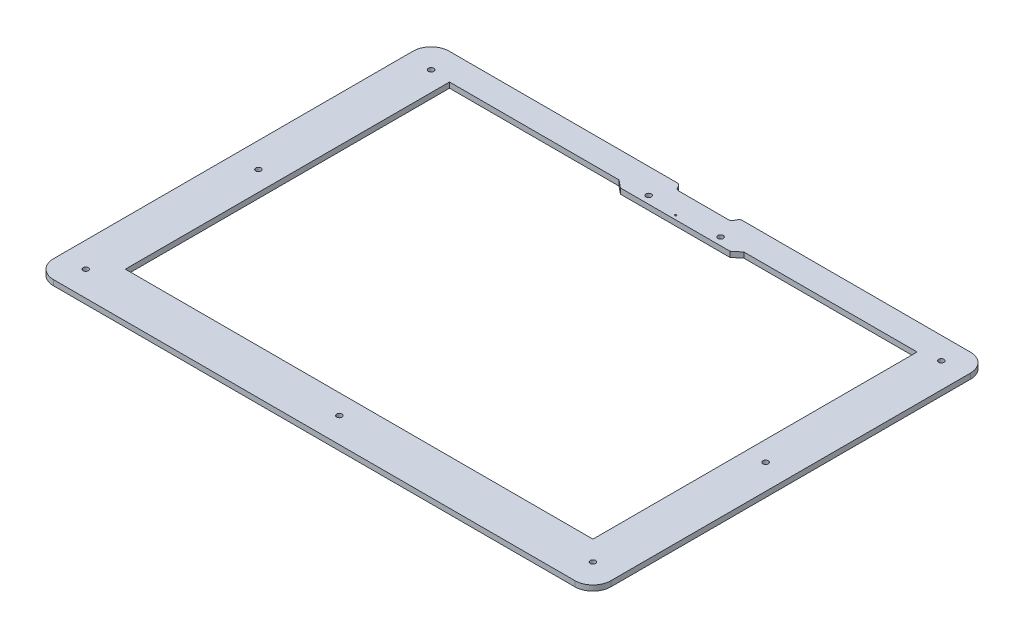
ISO-10303-21;
HEADER;
FILE_DESCRIPTION(('STEP AP214'),'2;1');
FILE_NAME('part.step','',(''),(''),'','','');
FILE_SCHEMA(('AUTOMOTIVE_DESIGN { 1 0 10303 214 1 1 1 1 }'));
ENDSEC;
DATA;
#1=APPLICATION_CONTEXT('core data for automotive mechanical design processes');
#2=APPLICATION_PROTOCOL_DEFINITION('international standard','automotive_design',2000,#1);
#3=PRODUCT_CONTEXT('',#1,'mechanical');
#4=PRODUCT('Part','Part','',(#3));
#5=PRODUCT_RELATED_PRODUCT_CATEGORY('part','',(#4));
#6=PRODUCT_DEFINITION_FORMATION('','',#4);
#7=PRODUCT_DEFINITION_CONTEXT('part definition',#1,'design');
#8=PRODUCT_DEFINITION('design','',#6,#7);
#9=PRODUCT_DEFINITION_SHAPE('','',#8);
#10=(LENGTH_UNIT() NAMED_UNIT(*) SI_UNIT(.MILLI.,.METRE.));
#11=(NAMED_UNIT(*) PLANE_ANGLE_UNIT() SI_UNIT($,.RADIAN.));
#12=(NAMED_UNIT(*) SI_UNIT($,.STERADIAN.) SOLID_ANGLE_UNIT());
#13=UNCERTAINTY_MEASURE_WITH_UNIT(LENGTH_MEASURE(1.E-05),#10,'distance_accuracy_value','');
#14=(GEOMETRIC_REPRESENTATION_CONTEXT(3) GLOBAL_UNCERTAINTY_ASSIGNED_CONTEXT((#13)) GLOBAL_UNIT_ASSIGNED_CONTEXT((#10,
#11,#12)) REPRESENTATION_CONTEXT('',''));
#15=CARTESIAN_POINT('',(0.,0.,0.));
#16=DIRECTION('',(0.,0.,1.));
#17=DIRECTION('',(1.,0.,0.));
#18=AXIS2_PLACEMENT_3D('',#15,#16,#17);
#19=CARTESIAN_POINT('',(10.,3.,10.));
#20=DIRECTION('',(0.,1.,0.));
#21=DIRECTION('',(0.,0.,1.));
#22=AXIS2_PLACEMENT_3D('',#19,#20,#21);
#23=PLANE('',#22);
#24=DIRECTION('',(-1.,0.,0.));
#25=VECTOR('',#24,1.);
#26=CARTESIAN_POINT('',(119.25,3.,14.75));
#27=LINE('',#26,#25);
#28=CARTESIAN_POINT('',(119.25,3.,14.75));
#29=VERTEX_POINT('',#28);
#30=CARTESIAN_POINT('',(25.,3.,14.7500000000004));
#31=VERTEX_POINT('',#30);
#32=EDGE_CURVE('E210',#29,#31,#27,.T.);
#33=ORIENTED_EDGE('',*,*,#32,.F.);
#34=DIRECTION('',(-0.77518690013775,0.,-0.631731960450654));
#35=VECTOR('',#34,1.);
#36=CARTESIAN_POINT('',(123.544786903842,3.,18.25));
#37=LINE('',#36,#35);
#38=CARTESIAN_POINT('',(123.544786903842,3.,18.25));
#39=VERTEX_POINT('',#38);
#40=EDGE_CURVE('E201',#39,#29,#37,.T.);
#41=ORIENTED_EDGE('',*,*,#40,.F.);
#42=DIRECTION('',(-1.,0.,0.));
#43=VECTOR('',#42,1.);
#44=CARTESIAN_POINT('',(184.455213096158,3.,18.25));
#45=LINE('',#44,#43);
#46=CARTESIAN_POINT('',(184.455213096158,3.,18.25));
#47=VERTEX_POINT('',#46);
#48=EDGE_CURVE('E244',#47,#39,#45,.T.);
#49=ORIENTED_EDGE('',*,*,#48,.F.);
#50=DIRECTION('',(-0.775186900137753,0.,0.63173196045065));
#51=VECTOR('',#50,1.);
#52=CARTESIAN_POINT('',(184.455213096158,3.,18.25));
#53=LINE('',#52,#51);
#54=CARTESIAN_POINT('',(188.75,3.,14.75));
#55=VERTEX_POINT('',#54);
#56=EDGE_CURVE('E241',#55,#47,#53,.T.);
#57=ORIENTED_EDGE('',*,*,#56,.F.);
#58=DIRECTION('',(-1.,0.,0.));
#59=VECTOR('',#58,1.);
#60=CARTESIAN_POINT('',(188.75,3.,14.75));
#61=LINE('',#60,#59);
#62=CARTESIAN_POINT('',(285.,3.,14.75));
#63=VERTEX_POINT('',#62);
#64=EDGE_CURVE('E238',#63,#55,#61,.T.);
#65=ORIENTED_EDGE('',*,*,#64,.F.);
#66=DIRECTION('',(0.,0.,-1.));
#67=VECTOR('',#66,1.);
#68=CARTESIAN_POINT('',(285.,3.,195.));
#69=LINE('',#68,#67);
#70=CARTESIAN_POINT('',(285.,3.,195.));
#71=VERTEX_POINT('',#70);
#72=EDGE_CURVE('E235',#71,#63,#69,.T.);
#73=ORIENTED_EDGE('',*,*,#72,.F.);
#74=DIRECTION('',(1.,0.,0.));
#75=VECTOR('',#74,1.);
#76=CARTESIAN_POINT('',(25.,3.,195.));
#77=LINE('',#76,#75);
#78=CARTESIAN_POINT('',(25.,3.,195.));
#79=VERTEX_POINT('',#78);
#80=EDGE_CURVE('E229',#79,#71,#77,.T.);
#81=ORIENTED_EDGE('',*,*,#80,.F.);
#82=DIRECTION('',(0.,0.,1.));
#83=VECTOR('',#82,1.);
#84=CARTESIAN_POINT('',(25.,3.,14.7500000000004));
#85=LINE('',#84,#83);
#86=EDGE_CURVE('E225',#31,#79,#85,.T.);
#87=ORIENTED_EDGE('',*,*,#86,.F.);
#88=EDGE_LOOP('',(#33,#41,#49,#57,#65,#73,#81,#87));
#89=FACE_BOUND('',#88,.T.);
#90=CARTESIAN_POINT('',(135.,3.,14.));
#91=DIRECTION('',(0.,1.,0.));
#92=DIRECTION('',(0.,0.,1.));
#93=AXIS2_PLACEMENT_3D('',#90,#91,#92);
#94=CIRCLE('',#93,1.49999999999997);
#95=CARTESIAN_POINT('',(135.,3.,15.5));
#96=VERTEX_POINT('',#95);
#97=EDGE_CURVE('E293',#96,#96,#94,.T.);
#98=ORIENTED_EDGE('',*,*,#97,.F.);
#99=EDGE_LOOP('',(#98));
#100=FACE_BOUND('',#99,.T.);
#101=CARTESIAN_POINT('',(175.,3.,14.));
#102=DIRECTION('',(0.,1.,0.));
#103=DIRECTION('',(0.,0.,1.));
#104=AXIS2_PLACEMENT_3D('',#101,#102,#103);
#105=CIRCLE('',#104,1.49999999999997);
#106=CARTESIAN_POINT('',(175.,3.,15.5));
#107=VERTEX_POINT('',#106);
#108=EDGE_CURVE('E309',#107,#107,#105,.T.);
#109=ORIENTED_EDGE('',*,*,#108,.F.);
#110=EDGE_LOOP('',(#109));
#111=FACE_BOUND('',#110,.T.);
#112=CARTESIAN_POINT('',(296.,3.,12.2856825395512));
#113=DIRECTION('',(0.,1.,0.));
#114=DIRECTION('',(0.,0.,1.));
#115=AXIS2_PLACEMENT_3D('',#112,#113,#114);
#116=CIRCLE('',#115,1.49999999999997);
#117=CARTESIAN_POINT('',(296.,3.,13.7856825395512));
#118=VERTEX_POINT('',#117);
#119=EDGE_CURVE('E325',#118,#118,#116,.T.);
#120=ORIENTED_EDGE('',*,*,#119,.F.);
#121=EDGE_LOOP('',(#120));
#122=FACE_BOUND('',#121,.T.);
#123=CARTESIAN_POINT('',(14.,3.,206.));
#124=DIRECTION('',(0.,1.,0.));
#125=DIRECTION('',(0.,0.,1.));
#126=AXIS2_PLACEMENT_3D('',#123,#124,#125);
#127=CIRCLE('',#126,1.5);
#128=CARTESIAN_POINT('',(14.,3.,207.5));
#129=VERTEX_POINT('',#128);
#130=EDGE_CURVE('E341',#129,#129,#127,.T.);
#131=ORIENTED_EDGE('',*,*,#130,.F.);
#132=EDGE_LOOP('',(#131));
#133=FACE_BOUND('',#132,.T.);
#134=CARTESIAN_POINT('',(296.,3.,110.));
#135=DIRECTION('',(0.,1.,0.));
#136=DIRECTION('',(0.,0.,1.));
#137=AXIS2_PLACEMENT_3D('',#134,#135,#136);
#138=CIRCLE('',#137,1.49999999999997);
#139=CARTESIAN_POINT('',(296.,3.,111.5));
#140=VERTEX_POINT('',#139);
#141=EDGE_CURVE('E357',#140,#140,#138,.T.);
#142=ORIENTED_EDGE('',*,*,#141,.F.);
#143=EDGE_LOOP('',(#142));
#144=FACE_BOUND('',#143,.T.);
#145=CARTESIAN_POINT('',(10.,3.,10.));
#146=DIRECTION('',(0.,1.,0.));
#147=DIRECTION('',(0.,0.,1.));
#148=AXIS2_PLACEMENT_3D('',#145,#146,#147);
#149=CIRCLE('',#148,10.);
#150=CARTESIAN_POINT('',(10.,3.,0.));
#151=VERTEX_POINT('',#150);
#152=CARTESIAN_POINT('',(0.,3.,10.));
#153=VERTEX_POINT('',#152);
#154=EDGE_CURVE('E365',#151,#153,#149,.T.);
#155=ORIENTED_EDGE('',*,*,#154,.T.);
#156=DIRECTION('',(0.,0.,1.));
#157=VECTOR('',#156,1.);
#158=CARTESIAN_POINT('',(0.,3.,10.));
#159=LINE('',#158,#157);
#160=CARTESIAN_POINT('',(0.,3.,210.));
#161=VERTEX_POINT('',#160);
#162=EDGE_CURVE('E369',#153,#161,#159,.T.);
#163=ORIENTED_EDGE('',*,*,#162,.T.);
#164=CARTESIAN_POINT('',(10.,3.,210.));
#165=DIRECTION('',(0.,1.,0.));
#166=DIRECTION('',(0.,0.,1.));
#167=AXIS2_PLACEMENT_3D('',#164,#165,#166);
#168=CIRCLE('',#167,10.);
#169=CARTESIAN_POINT('',(10.,3.,220.));
#170=VERTEX_POINT('',#169);
#171=EDGE_CURVE('E373',#161,#170,#168,.T.);
#172=ORIENTED_EDGE('',*,*,#171,.T.);
#173=DIRECTION('',(1.,0.,0.));
#174=VECTOR('',#173,1.);
#175=CARTESIAN_POINT('',(10.,3.,220.));
#176=LINE('',#175,#174);
#177=CARTESIAN_POINT('',(300.,3.,220.));
#178=VERTEX_POINT('',#177);
#179=EDGE_CURVE('E376',#170,#178,#176,.T.);
#180=ORIENTED_EDGE('',*,*,#179,.T.);
#181=CARTESIAN_POINT('',(300.,3.,210.));
#182=DIRECTION('',(0.,1.,0.));
#183=DIRECTION('',(0.,0.,1.));
#184=AXIS2_PLACEMENT_3D('',#181,#182,#183);
#185=CIRCLE('',#184,9.99999999999999);
#186=CARTESIAN_POINT('',(310.,3.,210.));
#187=VERTEX_POINT('',#186);
#188=EDGE_CURVE('E379',#178,#187,#185,.T.);
#189=ORIENTED_EDGE('',*,*,#188,.T.);
#190=DIRECTION('',(0.,0.,-1.));
#191=VECTOR('',#190,1.);
#192=CARTESIAN_POINT('',(310.,3.,10.));
#193=LINE('',#192,#191);
#194=CARTESIAN_POINT('',(310.,3.,10.));
#195=VERTEX_POINT('',#194);
#196=EDGE_CURVE('E382',#187,#195,#193,.T.);
#197=ORIENTED_EDGE('',*,*,#196,.T.);
#198=CARTESIAN_POINT('',(300.,3.,10.));
#199=DIRECTION('',(0.,1.,0.));
#200=DIRECTION('',(0.,0.,-1.));
#201=AXIS2_PLACEMENT_3D('',#198,#199,#200);
#202=CIRCLE('',#201,9.99999999999998);
#203=CARTESIAN_POINT('',(300.,3.,0.));
#204=VERTEX_POINT('',#203);
#205=EDGE_CURVE('E385',#195,#204,#202,.T.);
#206=ORIENTED_EDGE('',*,*,#205,.T.);
#207=DIRECTION('',(-1.,0.,0.));
#208=VECTOR('',#207,1.);
#209=CARTESIAN_POINT('',(173.115639288473,3.,0.));
#210=LINE('',#209,#208);
#211=CARTESIAN_POINT('',(173.115639288473,3.,0.));
#212=VERTEX_POINT('',#211);
#213=EDGE_CURVE('E388',#204,#212,#210,.T.);
#214=ORIENTED_EDGE('',*,*,#213,.T.);
#215=CARTESIAN_POINT('',(173.115639288473,3.,2.));
#216=DIRECTION('',(0.,1.,0.));
#217=DIRECTION('',(0.,0.,1.));
#218=AXIS2_PLACEMENT_3D('',#215,#216,#217);
#219=CIRCLE('',#218,2.00000000000001);
#220=CARTESIAN_POINT('',(171.365639288473,3.,1.03175416344815));
#221=VERTEX_POINT('',#220);
#222=EDGE_CURVE('E391',#212,#221,#219,.T.);
#223=ORIENTED_EDGE('',*,*,#222,.T.);
#224=DIRECTION('',(-0.484122918275928,0.,0.874999999999999));
#225=VECTOR('',#224,1.);
#226=CARTESIAN_POINT('',(170.570852384631,3.,2.46824583655185));
#227=LINE('',#226,#225);
#228=CARTESIAN_POINT('',(170.570852384631,3.,2.46824583655186));
#229=VERTEX_POINT('',#228);
#230=EDGE_CURVE('E394',#221,#229,#227,.T.);
#231=ORIENTED_EDGE('',*,*,#230,.T.);
#232=CARTESIAN_POINT('',(168.820852384631,3.,1.5));
#233=DIRECTION('',(0.,-1.,0.));
#234=DIRECTION('',(0.,0.,-1.));
#235=AXIS2_PLACEMENT_3D('',#232,#233,#234);
#236=CIRCLE('',#235,1.99999999999999);
#237=CARTESIAN_POINT('',(168.820852384631,3.,3.5));
#238=VERTEX_POINT('',#237);
#239=EDGE_CURVE('E397',#229,#238,#236,.T.);
#240=ORIENTED_EDGE('',*,*,#239,.T.);
#241=DIRECTION('',(-1.,0.,0.));
#242=VECTOR('',#241,1.);
#243=CARTESIAN_POINT('',(141.179147615369,3.,3.5));
#244=LINE('',#243,#242);
#245=CARTESIAN_POINT('',(141.179147615369,3.,3.50000000000002));
#246=VERTEX_POINT('',#245);
#247=EDGE_CURVE('E400',#238,#246,#244,.T.);
#248=ORIENTED_EDGE('',*,*,#247,.T.);
#249=CARTESIAN_POINT('',(141.179147615369,3.,1.5));
#250=DIRECTION('',(0.,-1.,0.));
#251=DIRECTION('',(0.,0.,-1.));
#252=AXIS2_PLACEMENT_3D('',#249,#250,#251);
#253=CIRCLE('',#252,2.00000000000002);
#254=CARTESIAN_POINT('',(139.429147615369,3.,2.46824583655182));
#255=VERTEX_POINT('',#254);
#256=EDGE_CURVE('E403',#246,#255,#253,.T.);
#257=ORIENTED_EDGE('',*,*,#256,.T.);
#258=DIRECTION('',(-0.484122918275918,0.,-0.875000000000005));
#259=VECTOR('',#258,1.);
#260=CARTESIAN_POINT('',(139.429147615369,3.,2.46824583655182));
#261=LINE('',#260,#259);
#262=CARTESIAN_POINT('',(138.634360711527,3.,1.03175416344817));
#263=VERTEX_POINT('',#262);
#264=EDGE_CURVE('E406',#255,#263,#261,.T.);
#265=ORIENTED_EDGE('',*,*,#264,.T.);
#266=CARTESIAN_POINT('',(136.884360711527,3.,2.));
#267=DIRECTION('',(0.,1.,0.));
#268=DIRECTION('',(0.,0.,-1.));
#269=AXIS2_PLACEMENT_3D('',#266,#267,#268);
#270=CIRCLE('',#269,1.99999999999999);
#271=CARTESIAN_POINT('',(136.884360711527,3.,0.));
#272=VERTEX_POINT('',#271);
#273=EDGE_CURVE('E409',#263,#272,#270,.T.);
#274=ORIENTED_EDGE('',*,*,#273,.T.);
#275=DIRECTION('',(-1.,0.,0.));
#276=VECTOR('',#275,1.);
#277=CARTESIAN_POINT('',(10.,3.,0.));
#278=LINE('',#277,#276);
#279=EDGE_CURVE('E412',#272,#151,#278,.T.);
#280=ORIENTED_EDGE('',*,*,#279,.T.);
#281=EDGE_LOOP('',(#155,#163,#172,#180,#189,#197,#206,#214,#223,#231,#240,#248,#257,#265,#274,#280));
#282=FACE_BOUND('',#281,.T.);
#283=CARTESIAN_POINT('',(14.,3.,14.));
#284=DIRECTION('',(0.,1.,0.));
#285=DIRECTION('',(0.,0.,1.));
#286=AXIS2_PLACEMENT_3D('',#283,#284,#285);
#287=CIRCLE('',#286,1.5);
#288=CARTESIAN_POINT('',(14.,3.,15.5));
#289=VERTEX_POINT('',#288);
#290=EDGE_CURVE('E349',#289,#289,#287,.T.);
#291=ORIENTED_EDGE('',*,*,#290,.F.);
#292=EDGE_LOOP('',(#291));
#293=FACE_BOUND('',#292,.T.);
#294=CARTESIAN_POINT('',(296.,3.,206.));
#295=DIRECTION('',(0.,1.,0.));
#296=DIRECTION('',(0.,0.,1.));
#297=AXIS2_PLACEMENT_3D('',#294,#295,#296);
#298=CIRCLE('',#297,1.49999999999996);
#299=CARTESIAN_POINT('',(296.,3.,207.5));
#300=VERTEX_POINT('',#299);
#301=EDGE_CURVE('E333',#300,#300,#298,.T.);
#302=ORIENTED_EDGE('',*,*,#301,.F.);
#303=EDGE_LOOP('',(#302));
#304=FACE_BOUND('',#303,.T.);
#305=CARTESIAN_POINT('',(155.,3.,206.));
#306=DIRECTION('',(0.,1.,0.));
#307=DIRECTION('',(0.,0.,1.));
#308=AXIS2_PLACEMENT_3D('',#305,#306,#307);
#309=CIRCLE('',#308,1.5);
#310=CARTESIAN_POINT('',(155.,3.,207.5));
#311=VERTEX_POINT('',#310);
#312=EDGE_CURVE('E317',#311,#311,#309,.T.);
#313=ORIENTED_EDGE('',*,*,#312,.F.);
#314=EDGE_LOOP('',(#313));
#315=FACE_BOUND('',#314,.T.);
#316=CARTESIAN_POINT('',(14.,3.,110.));
#317=DIRECTION('',(0.,1.,0.));
#318=DIRECTION('',(0.,0.,1.));
#319=AXIS2_PLACEMENT_3D('',#316,#317,#318);
#320=CIRCLE('',#319,1.49999999999997);
#321=CARTESIAN_POINT('',(14.,3.,111.5));
#322=VERTEX_POINT('',#321);
#323=EDGE_CURVE('E301',#322,#322,#320,.T.);
#324=ORIENTED_EDGE('',*,*,#323,.F.);
#325=EDGE_LOOP('',(#324));
#326=FACE_BOUND('',#325,.T.);
#327=CARTESIAN_POINT('',(152.,3.,16.));
#328=DIRECTION('',(0.,1.,0.));
#329=DIRECTION('',(0.,0.,1.));
#330=AXIS2_PLACEMENT_3D('',#327,#328,#329);
#331=CIRCLE('',#330,0.499999999999999);
#332=CARTESIAN_POINT('',(152.,3.,16.5));
#333=VERTEX_POINT('',#332);
#334=EDGE_CURVE('E249',#333,#333,#331,.T.);
#335=ORIENTED_EDGE('',*,*,#334,.F.);
#336=EDGE_LOOP('',(#335));
#337=FACE_BOUND('',#336,.T.);
#338=ADVANCED_FACE('F39',(#89,#100,#111,#122,#133,#144,#282,#293,#304,#315,#326,#337),#23,.T.);
#339=CARTESIAN_POINT('',(10.,0.,10.));
#340=DIRECTION('',(0.,1.,0.));
#341=DIRECTION('',(0.,0.,1.));
#342=AXIS2_PLACEMENT_3D('',#339,#340,#341);
#343=PLANE('',#342);
#344=CARTESIAN_POINT('',(135.,0.,14.));
#345=DIRECTION('',(0.,1.,0.));
#346=DIRECTION('',(0.,0.,1.));
#347=AXIS2_PLACEMENT_3D('',#344,#345,#346);
#348=CIRCLE('',#347,1.49999999999997);
#349=CARTESIAN_POINT('',(135.,0.,15.5));
#350=VERTEX_POINT('',#349);
#351=EDGE_CURVE('E219',#350,#350,#348,.T.);
#352=ORIENTED_EDGE('',*,*,#351,.T.);
#353=EDGE_LOOP('',(#352));
#354=FACE_BOUND('',#353,.T.);
#355=CARTESIAN_POINT('',(14.,0.,110.));
#356=DIRECTION('',(0.,1.,0.));
#357=DIRECTION('',(0.,0.,1.));
#358=AXIS2_PLACEMENT_3D('',#355,#356,#357);
#359=CIRCLE('',#358,1.49999999999997);
#360=CARTESIAN_POINT('',(14.,0.,111.5));
#361=VERTEX_POINT('',#360);
#362=EDGE_CURVE('E297',#361,#361,#359,.T.);
#363=ORIENTED_EDGE('',*,*,#362,.T.);
#364=EDGE_LOOP('',(#363));
#365=FACE_BOUND('',#364,.T.);
#366=CARTESIAN_POINT('',(175.,0.,14.));
#367=DIRECTION('',(0.,1.,0.));
#368=DIRECTION('',(0.,0.,1.));
#369=AXIS2_PLACEMENT_3D('',#366,#367,#368);
#370=CIRCLE('',#369,1.49999999999997);
#371=CARTESIAN_POINT('',(175.,0.,15.5));
#372=VERTEX_POINT('',#371);
#373=EDGE_CURVE('E305',#372,#372,#370,.T.);
#374=ORIENTED_EDGE('',*,*,#373,.T.);
#375=EDGE_LOOP('',(#374));
#376=FACE_BOUND('',#375,.T.);
#377=CARTESIAN_POINT('',(155.,0.,206.));
#378=DIRECTION('',(0.,1.,0.));
#379=DIRECTION('',(0.,0.,1.));
#380=AXIS2_PLACEMENT_3D('',#377,#378,#379);
#381=CIRCLE('',#380,1.5);
#382=CARTESIAN_POINT('',(155.,0.,207.5));
#383=VERTEX_POINT('',#382);
#384=EDGE_CURVE('E313',#383,#383,#381,.T.);
#385=ORIENTED_EDGE('',*,*,#384,.T.);
#386=EDGE_LOOP('',(#385));
#387=FACE_BOUND('',#386,.T.);
#388=CARTESIAN_POINT('',(296.,0.,12.2856825395512));
#389=DIRECTION('',(0.,1.,0.));
#390=DIRECTION('',(0.,0.,1.));
#391=AXIS2_PLACEMENT_3D('',#388,#389,#390);
#392=CIRCLE('',#391,1.49999999999997);
#393=CARTESIAN_POINT('',(296.,0.,13.7856825395512));
#394=VERTEX_POINT('',#393);
#395=EDGE_CURVE('E321',#394,#394,#392,.T.);
#396=ORIENTED_EDGE('',*,*,#395,.T.);
#397=EDGE_LOOP('',(#396));
#398=FACE_BOUND('',#397,.T.);
#399=CARTESIAN_POINT('',(296.,0.,206.));
#400=DIRECTION('',(0.,1.,0.));
#401=DIRECTION('',(0.,0.,1.));
#402=AXIS2_PLACEMENT_3D('',#399,#400,#401);
#403=CIRCLE('',#402,1.49999999999996);
#404=CARTESIAN_POINT('',(296.,0.,207.5));
#405=VERTEX_POINT('',#404);
#406=EDGE_CURVE('E329',#405,#405,#403,.T.);
#407=ORIENTED_EDGE('',*,*,#406,.T.);
#408=EDGE_LOOP('',(#407));
#409=FACE_BOUND('',#408,.T.);
#410=CARTESIAN_POINT('',(14.,0.,206.));
#411=DIRECTION('',(0.,1.,0.));
#412=DIRECTION('',(0.,0.,1.));
#413=AXIS2_PLACEMENT_3D('',#410,#411,#412);
#414=CIRCLE('',#413,1.5);
#415=CARTESIAN_POINT('',(14.,0.,207.5));
#416=VERTEX_POINT('',#415);
#417=EDGE_CURVE('E337',#416,#416,#414,.T.);
#418=ORIENTED_EDGE('',*,*,#417,.T.);
#419=EDGE_LOOP('',(#418));
#420=FACE_BOUND('',#419,.T.);
#421=CARTESIAN_POINT('',(14.,0.,14.));
#422=DIRECTION('',(0.,1.,0.));
#423=DIRECTION('',(0.,0.,1.));
#424=AXIS2_PLACEMENT_3D('',#421,#422,#423);
#425=CIRCLE('',#424,1.5);
#426=CARTESIAN_POINT('',(14.,0.,15.5));
#427=VERTEX_POINT('',#426);
#428=EDGE_CURVE('E345',#427,#427,#425,.T.);
#429=ORIENTED_EDGE('',*,*,#428,.T.);
#430=EDGE_LOOP('',(#429));
#431=FACE_BOUND('',#430,.T.);
#432=CARTESIAN_POINT('',(296.,0.,110.));
#433=DIRECTION('',(0.,1.,0.));
#434=DIRECTION('',(0.,0.,1.));
#435=AXIS2_PLACEMENT_3D('',#432,#433,#434);
#436=CIRCLE('',#435,1.49999999999997);
#437=CARTESIAN_POINT('',(296.,0.,111.5));
#438=VERTEX_POINT('',#437);
#439=EDGE_CURVE('E353',#438,#438,#436,.T.);
#440=ORIENTED_EDGE('',*,*,#439,.T.);
#441=EDGE_LOOP('',(#440));
#442=FACE_BOUND('',#441,.T.);
#443=CARTESIAN_POINT('',(10.,0.,10.));
#444=DIRECTION('',(0.,1.,0.));
#445=DIRECTION('',(0.,0.,1.));
#446=AXIS2_PLACEMENT_3D('',#443,#444,#445);
#447=CIRCLE('',#446,10.);
#448=CARTESIAN_POINT('',(10.,0.,0.));
#449=VERTEX_POINT('',#448);
#450=CARTESIAN_POINT('',(0.,0.,10.));
#451=VERTEX_POINT('',#450);
#452=EDGE_CURVE('E361',#449,#451,#447,.T.);
#453=ORIENTED_EDGE('',*,*,#452,.F.);
#454=DIRECTION('',(-1.,0.,0.));
#455=VECTOR('',#454,1.);
#456=CARTESIAN_POINT('',(10.,0.,0.));
#457=LINE('',#456,#455);
#458=CARTESIAN_POINT('',(136.884360711527,0.,0.));
#459=VERTEX_POINT('',#458);
#460=EDGE_CURVE('E370',#459,#449,#457,.T.);
#461=ORIENTED_EDGE('',*,*,#460,.F.);
#462=CARTESIAN_POINT('',(136.884360711527,0.,2.));
#463=DIRECTION('',(0.,1.,0.));
#464=DIRECTION('',(0.,0.,-1.));
#465=AXIS2_PLACEMENT_3D('',#462,#463,#464);
#466=CIRCLE('',#465,1.99999999999999);
#467=CARTESIAN_POINT('',(138.634360711527,0.,1.03175416344817));
#468=VERTEX_POINT('',#467);
#469=EDGE_CURVE('E458',#468,#459,#466,.T.);
#470=ORIENTED_EDGE('',*,*,#469,.F.);
#471=DIRECTION('',(-0.484122918275918,0.,-0.875000000000005));
#472=VECTOR('',#471,1.);
#473=CARTESIAN_POINT('',(139.429147615369,0.,2.46824583655182));
#474=LINE('',#473,#472);
#475=CARTESIAN_POINT('',(139.429147615369,0.,2.46824583655182));
#476=VERTEX_POINT('',#475);
#477=EDGE_CURVE('E455',#476,#468,#474,.T.);
#478=ORIENTED_EDGE('',*,*,#477,.F.);
#479=CARTESIAN_POINT('',(141.179147615369,0.,1.5));
#480=DIRECTION('',(0.,-1.,0.));
#481=DIRECTION('',(0.,0.,-1.));
#482=AXIS2_PLACEMENT_3D('',#479,#480,#481);
#483=CIRCLE('',#482,2.00000000000002);
#484=CARTESIAN_POINT('',(141.179147615369,0.,3.50000000000002));
#485=VERTEX_POINT('',#484);
#486=EDGE_CURVE('E452',#485,#476,#483,.T.);
#487=ORIENTED_EDGE('',*,*,#486,.F.);
#488=DIRECTION('',(-1.,0.,0.));
#489=VECTOR('',#488,1.);
#490=CARTESIAN_POINT('',(141.179147615369,0.,3.5));
#491=LINE('',#490,#489);
#492=CARTESIAN_POINT('',(168.820852384631,0.,3.5));
#493=VERTEX_POINT('',#492);
#494=EDGE_CURVE('E449',#493,#485,#491,.T.);
#495=ORIENTED_EDGE('',*,*,#494,.F.);
#496=CARTESIAN_POINT('',(168.820852384631,0.,1.5));
#497=DIRECTION('',(0.,-1.,0.));
#498=DIRECTION('',(0.,0.,-1.));
#499=AXIS2_PLACEMENT_3D('',#496,#497,#498);
#500=CIRCLE('',#499,1.99999999999999);
#501=CARTESIAN_POINT('',(170.570852384631,0.,2.46824583655186));
#502=VERTEX_POINT('',#501);
#503=EDGE_CURVE('E446',#502,#493,#500,.T.);
#504=ORIENTED_EDGE('',*,*,#503,.F.);
#505=DIRECTION('',(-0.484122918275928,0.,0.874999999999999));
#506=VECTOR('',#505,1.);
#507=CARTESIAN_POINT('',(170.570852384631,0.,2.46824583655185));
#508=LINE('',#507,#506);
#509=CARTESIAN_POINT('',(171.365639288473,0.,1.03175416344815));
#510=VERTEX_POINT('',#509);
#511=EDGE_CURVE('E443',#510,#502,#508,.T.);
#512=ORIENTED_EDGE('',*,*,#511,.F.);
#513=CARTESIAN_POINT('',(173.115639288473,0.,2.));
#514=DIRECTION('',(0.,1.,0.));
#515=DIRECTION('',(0.,0.,1.));
#516=AXIS2_PLACEMENT_3D('',#513,#514,#515);
#517=CIRCLE('',#516,2.00000000000001);
#518=CARTESIAN_POINT('',(173.115639288473,0.,0.));
#519=VERTEX_POINT('',#518);
#520=EDGE_CURVE('E440',#519,#510,#517,.T.);
#521=ORIENTED_EDGE('',*,*,#520,.F.);
#522=DIRECTION('',(-1.,0.,0.));
#523=VECTOR('',#522,1.);
#524=CARTESIAN_POINT('',(173.115639288473,0.,0.));
#525=LINE('',#524,#523);
#526=CARTESIAN_POINT('',(300.,0.,0.));
#527=VERTEX_POINT('',#526);
#528=EDGE_CURVE('E437',#527,#519,#525,.T.);
#529=ORIENTED_EDGE('',*,*,#528,.F.);
#530=CARTESIAN_POINT('',(300.,0.,10.));
#531=DIRECTION('',(0.,1.,0.));
#532=DIRECTION('',(0.,0.,-1.));
#533=AXIS2_PLACEMENT_3D('',#530,#531,#532);
#534=CIRCLE('',#533,9.99999999999998);
#535=CARTESIAN_POINT('',(310.,0.,10.));
#536=VERTEX_POINT('',#535);
#537=EDGE_CURVE('E434',#536,#527,#534,.T.);
#538=ORIENTED_EDGE('',*,*,#537,.F.);
#539=DIRECTION('',(0.,0.,-1.));
#540=VECTOR('',#539,1.);
#541=CARTESIAN_POINT('',(310.,0.,10.));
#542=LINE('',#541,#540);
#543=CARTESIAN_POINT('',(310.,0.,210.));
#544=VERTEX_POINT('',#543);
#545=EDGE_CURVE('E431',#544,#536,#542,.T.);
#546=ORIENTED_EDGE('',*,*,#545,.F.);
#547=CARTESIAN_POINT('',(300.,0.,210.));
#548=DIRECTION('',(0.,1.,0.));
#549=DIRECTION('',(0.,0.,1.));
#550=AXIS2_PLACEMENT_3D('',#547,#548,#549);
#551=CIRCLE('',#550,9.99999999999999);
#552=CARTESIAN_POINT('',(300.,0.,220.));
#553=VERTEX_POINT('',#552);
#554=EDGE_CURVE('E428',#553,#544,#551,.T.);
#555=ORIENTED_EDGE('',*,*,#554,.F.);
#556=DIRECTION('',(1.,0.,0.));
#557=VECTOR('',#556,1.);
#558=CARTESIAN_POINT('',(10.,0.,220.));
#559=LINE('',#558,#557);
#560=CARTESIAN_POINT('',(10.,0.,220.));
#561=VERTEX_POINT('',#560);
#562=EDGE_CURVE('E425',#561,#553,#559,.T.);
#563=ORIENTED_EDGE('',*,*,#562,.F.);
#564=CARTESIAN_POINT('',(10.,0.,210.));
#565=DIRECTION('',(0.,1.,0.));
#566=DIRECTION('',(0.,0.,1.));
#567=AXIS2_PLACEMENT_3D('',#564,#565,#566);
#568=CIRCLE('',#567,10.);
#569=CARTESIAN_POINT('',(0.,0.,210.));
#570=VERTEX_POINT('',#569);
#571=EDGE_CURVE('E422',#570,#561,#568,.T.);
#572=ORIENTED_EDGE('',*,*,#571,.F.);
#573=DIRECTION('',(0.,0.,1.));
#574=VECTOR('',#573,1.);
#575=CARTESIAN_POINT('',(0.,0.,10.));
#576=LINE('',#575,#574);
#577=EDGE_CURVE('E419',#451,#570,#576,.T.);
#578=ORIENTED_EDGE('',*,*,#577,.F.);
#579=EDGE_LOOP('',(#453,#461,#470,#478,#487,#495,#504,#512,#521,#529,#538,#546,#555,#563,#572,#578));
#580=FACE_BOUND('',#579,.T.);
#581=DIRECTION('',(-0.77518690013775,0.,-0.631731960450654));
#582=VECTOR('',#581,1.);
#583=CARTESIAN_POINT('',(123.544786903842,0.,18.25));
#584=LINE('',#583,#582);
#585=CARTESIAN_POINT('',(123.544786903842,0.,18.25));
#586=VERTEX_POINT('',#585);
#587=CARTESIAN_POINT('',(119.25,0.,14.75));
#588=VERTEX_POINT('',#587);
#589=EDGE_CURVE('E63',#586,#588,#584,.T.);
#590=ORIENTED_EDGE('',*,*,#589,.T.);
#591=DIRECTION('',(-1.,0.,0.));
#592=VECTOR('',#591,1.);
#593=CARTESIAN_POINT('',(119.25,0.,14.75));
#594=LINE('',#593,#592);
#595=CARTESIAN_POINT('',(25.,0.,14.7500000000004));
#596=VERTEX_POINT('',#595);
#597=EDGE_CURVE('E217',#588,#596,#594,.T.);
#598=ORIENTED_EDGE('',*,*,#597,.T.);
#599=DIRECTION('',(0.,0.,1.));
#600=VECTOR('',#599,1.);
#601=CARTESIAN_POINT('',(25.,0.,14.7500000000004));
#602=LINE('',#601,#600);
#603=CARTESIAN_POINT('',(25.,0.,195.));
#604=VERTEX_POINT('',#603);
#605=EDGE_CURVE('E252',#596,#604,#602,.T.);
#606=ORIENTED_EDGE('',*,*,#605,.T.);
#607=DIRECTION('',(1.,0.,0.));
#608=VECTOR('',#607,1.);
#609=CARTESIAN_POINT('',(25.,0.,195.));
#610=LINE('',#609,#608);
#611=CARTESIAN_POINT('',(285.,0.,195.));
#612=VERTEX_POINT('',#611);
#613=EDGE_CURVE('E256',#604,#612,#610,.T.);
#614=ORIENTED_EDGE('',*,*,#613,.T.);
#615=DIRECTION('',(0.,0.,-1.));
#616=VECTOR('',#615,1.);
#617=CARTESIAN_POINT('',(285.,0.,195.));
#618=LINE('',#617,#616);
#619=CARTESIAN_POINT('',(285.,0.,14.75));
#620=VERTEX_POINT('',#619);
#621=EDGE_CURVE('E260',#612,#620,#618,.T.);
#622=ORIENTED_EDGE('',*,*,#621,.T.);
#623=DIRECTION('',(-1.,0.,0.));
#624=VECTOR('',#623,1.);
#625=CARTESIAN_POINT('',(188.75,0.,14.75));
#626=LINE('',#625,#624);
#627=CARTESIAN_POINT('',(188.75,0.,14.75));
#628=VERTEX_POINT('',#627);
#629=EDGE_CURVE('E264',#620,#628,#626,.T.);
#630=ORIENTED_EDGE('',*,*,#629,.T.);
#631=DIRECTION('',(-0.775186900137753,0.,0.63173196045065));
#632=VECTOR('',#631,1.);
#633=CARTESIAN_POINT('',(184.455213096158,0.,18.25));
#634=LINE('',#633,#632);
#635=CARTESIAN_POINT('',(184.455213096158,0.,18.25));
#636=VERTEX_POINT('',#635);
#637=EDGE_CURVE('E268',#628,#636,#634,.T.);
#638=ORIENTED_EDGE('',*,*,#637,.T.);
#639=DIRECTION('',(-1.,0.,0.));
#640=VECTOR('',#639,1.);
#641=CARTESIAN_POINT('',(123.544786903842,0.,18.25));
#642=LINE('',#641,#640);
#643=EDGE_CURVE('E211',#636,#586,#642,.T.);
#644=ORIENTED_EDGE('',*,*,#643,.T.);
#645=EDGE_LOOP('',(#590,#598,#606,#614,#622,#630,#638,#644));
#646=FACE_BOUND('',#645,.T.);
#647=CARTESIAN_POINT('',(152.,0.,16.));
#648=DIRECTION('',(0.,1.,0.));
#649=DIRECTION('',(0.,0.,1.));
#650=AXIS2_PLACEMENT_3D('',#647,#648,#649);
#651=CIRCLE('',#650,0.499999999999999);
#652=CARTESIAN_POINT('',(152.,0.,16.5));
#653=VERTEX_POINT('',#652);
#654=EDGE_CURVE('E930',#653,#653,#651,.T.);
#655=ORIENTED_EDGE('',*,*,#654,.T.);
#656=EDGE_LOOP('',(#655));
#657=FACE_BOUND('',#656,.T.);
#658=ADVANCED_FACE('F529',(#354,#365,#376,#387,#398,#409,#420,#431,#442,#580,#646,#657),#343,.F.);
#659=CARTESIAN_POINT('',(10.,3.,10.));
#660=DIRECTION('',(0.,-1.,0.));
#661=DIRECTION('',(0.,0.,-1.));
#662=AXIS2_PLACEMENT_3D('',#659,#660,#661);
#663=CYLINDRICAL_SURFACE('',#662,10.);
#664=ORIENTED_EDGE('',*,*,#452,.T.);
#665=DIRECTION('',(0.,-1.,0.));
#666=VECTOR('',#665,1.);
#667=CARTESIAN_POINT('',(0.,3.,10.));
#668=LINE('',#667,#666);
#669=EDGE_CURVE('E11',#153,#451,#668,.T.);
#670=ORIENTED_EDGE('',*,*,#669,.F.);
#671=ORIENTED_EDGE('',*,*,#154,.F.);
#672=DIRECTION('',(0.,-1.,0.));
#673=VECTOR('',#672,1.);
#674=CARTESIAN_POINT('',(10.,3.,0.));
#675=LINE('',#674,#673);
#676=EDGE_CURVE('E415',#151,#449,#675,.T.);
#677=ORIENTED_EDGE('',*,*,#676,.T.);
#678=EDGE_LOOP('',(#664,#670,#671,#677));
#679=FACE_BOUND('',#678,.T.);
#680=ADVANCED_FACE('F41',(#679),#663,.T.);
#681=CARTESIAN_POINT('',(0.,3.,10.));
#682=DIRECTION('',(1.,0.,0.));
#683=DIRECTION('',(0.,0.,-1.));
#684=AXIS2_PLACEMENT_3D('',#681,#682,#683);
#685=PLANE('',#684);
#686=ORIENTED_EDGE('',*,*,#577,.T.);
#687=DIRECTION('',(0.,-1.,0.));
#688=VECTOR('',#687,1.);
#689=CARTESIAN_POINT('',(0.,3.,210.));
#690=LINE('',#689,#688);
#691=EDGE_CURVE('E48',#161,#570,#690,.T.);
#692=ORIENTED_EDGE('',*,*,#691,.F.);
#693=ORIENTED_EDGE('',*,*,#162,.F.);
#694=ORIENTED_EDGE('',*,*,#669,.T.);
#695=EDGE_LOOP('',(#686,#692,#693,#694));
#696=FACE_BOUND('',#695,.T.);
#697=ADVANCED_FACE('F547',(#696),#685,.F.);
#698=CARTESIAN_POINT('',(10.,3.,210.));
#699=DIRECTION('',(0.,-1.,0.));
#700=DIRECTION('',(0.,0.,-1.));
#701=AXIS2_PLACEMENT_3D('',#698,#699,#700);
#702=CYLINDRICAL_SURFACE('',#701,10.);
#703=ORIENTED_EDGE('',*,*,#571,.T.);
#704=DIRECTION('',(0.,-1.,0.));
#705=VECTOR('',#704,1.);
#706=CARTESIAN_POINT('',(10.,3.,220.));
#707=LINE('',#706,#705);
#708=EDGE_CURVE('E514',#170,#561,#707,.T.);
#709=ORIENTED_EDGE('',*,*,#708,.F.);
#710=ORIENTED_EDGE('',*,*,#171,.F.);
#711=ORIENTED_EDGE('',*,*,#691,.T.);
#712=EDGE_LOOP('',(#703,#709,#710,#711));
#713=FACE_BOUND('',#712,.T.);
#714=ADVANCED_FACE('F523',(#713),#702,.T.);
#715=CARTESIAN_POINT('',(10.,3.,220.));
#716=DIRECTION('',(0.,0.,-1.));
#717=DIRECTION('',(-1.,0.,0.));
#718=AXIS2_PLACEMENT_3D('',#715,#716,#717);
#719=PLANE('',#718);
#720=ORIENTED_EDGE('',*,*,#562,.T.);
#721=DIRECTION('',(0.,-1.,0.));
#722=VECTOR('',#721,1.);
#723=CARTESIAN_POINT('',(300.,3.,220.));
#724=LINE('',#723,#722);
#725=EDGE_CURVE('E510',#178,#553,#724,.T.);
#726=ORIENTED_EDGE('',*,*,#725,.F.);
#727=ORIENTED_EDGE('',*,*,#179,.F.);
#728=ORIENTED_EDGE('',*,*,#708,.T.);
#729=EDGE_LOOP('',(#720,#726,#727,#728));
#730=FACE_BOUND('',#729,.T.);
#731=ADVANCED_FACE('F535',(#730),#719,.F.);
#732=CARTESIAN_POINT('',(300.,3.,210.));
#733=DIRECTION('',(0.,-1.,0.));
#734=DIRECTION('',(0.,0.,-1.));
#735=AXIS2_PLACEMENT_3D('',#732,#733,#734);
#736=CYLINDRICAL_SURFACE('',#735,9.99999999999999);
#737=ORIENTED_EDGE('',*,*,#554,.T.);
#738=DIRECTION('',(0.,-1.,0.));
#739=VECTOR('',#738,1.);
#740=CARTESIAN_POINT('',(310.,3.,210.));
#741=LINE('',#740,#739);
#742=EDGE_CURVE('E506',#187,#544,#741,.T.);
#743=ORIENTED_EDGE('',*,*,#742,.F.);
#744=ORIENTED_EDGE('',*,*,#188,.F.);
#745=ORIENTED_EDGE('',*,*,#725,.T.);
#746=EDGE_LOOP('',(#737,#743,#744,#745));
#747=FACE_BOUND('',#746,.T.);
#748=ADVANCED_FACE('F539',(#747),#736,.T.);
#749=CARTESIAN_POINT('',(310.,3.,10.));
#750=DIRECTION('',(-1.,0.,0.));
#751=DIRECTION('',(0.,0.,1.));
#752=AXIS2_PLACEMENT_3D('',#749,#750,#751);
#753=PLANE('',#752);
#754=ORIENTED_EDGE('',*,*,#545,.T.);
#755=DIRECTION('',(0.,-1.,0.));
#756=VECTOR('',#755,1.);
#757=CARTESIAN_POINT('',(310.,3.,10.));
#758=LINE('',#757,#756);
#759=EDGE_CURVE('E502',#195,#536,#758,.T.);
#760=ORIENTED_EDGE('',*,*,#759,.F.);
#761=ORIENTED_EDGE('',*,*,#196,.F.);
#762=ORIENTED_EDGE('',*,*,#742,.T.);
#763=EDGE_LOOP('',(#754,#760,#761,#762));
#764=FACE_BOUND('',#763,.T.);
#765=ADVANCED_FACE('F600',(#764),#753,.F.);
#766=CARTESIAN_POINT('',(300.,3.,10.));
#767=DIRECTION('',(0.,-1.,0.));
#768=DIRECTION('',(0.,0.,-1.));
#769=AXIS2_PLACEMENT_3D('',#766,#767,#768);
#770=CYLINDRICAL_SURFACE('',#769,9.99999999999998);
#771=ORIENTED_EDGE('',*,*,#537,.T.);
#772=DIRECTION('',(0.,-1.,0.));
#773=VECTOR('',#772,1.);
#774=CARTESIAN_POINT('',(300.,3.,0.));
#775=LINE('',#774,#773);
#776=EDGE_CURVE('E498',#204,#527,#775,.T.);
#777=ORIENTED_EDGE('',*,*,#776,.F.);
#778=ORIENTED_EDGE('',*,*,#205,.F.);
#779=ORIENTED_EDGE('',*,*,#759,.T.);
#780=EDGE_LOOP('',(#771,#777,#778,#779));
#781=FACE_BOUND('',#780,.T.);
#782=ADVANCED_FACE('F597',(#781),#770,.T.);
#783=CARTESIAN_POINT('',(173.115639288473,3.,0.));
#784=DIRECTION('',(0.,0.,1.));
#785=DIRECTION('',(1.,0.,0.));
#786=AXIS2_PLACEMENT_3D('',#783,#784,#785);
#787=PLANE('',#786);
#788=ORIENTED_EDGE('',*,*,#528,.T.);
#789=DIRECTION('',(0.,-1.,0.));
#790=VECTOR('',#789,1.);
#791=CARTESIAN_POINT('',(173.115639288473,3.,0.));
#792=LINE('',#791,#790);
#793=EDGE_CURVE('E494',#212,#519,#792,.T.);
#794=ORIENTED_EDGE('',*,*,#793,.F.);
#795=ORIENTED_EDGE('',*,*,#213,.F.);
#796=ORIENTED_EDGE('',*,*,#776,.T.);
#797=EDGE_LOOP('',(#788,#794,#795,#796));
#798=FACE_BOUND('',#797,.T.);
#799=ADVANCED_FACE('F593',(#798),#787,.F.);
#800=CARTESIAN_POINT('',(173.115639288473,3.,2.));
#801=DIRECTION('',(0.,-1.,0.));
#802=DIRECTION('',(0.,0.,-1.));
#803=AXIS2_PLACEMENT_3D('',#800,#801,#802);
#804=CYLINDRICAL_SURFACE('',#803,2.00000000000001);
#805=ORIENTED_EDGE('',*,*,#520,.T.);
#806=DIRECTION('',(0.,-1.,0.));
#807=VECTOR('',#806,1.);
#808=CARTESIAN_POINT('',(171.365639288473,3.,1.03175416344815));
#809=LINE('',#808,#807);
#810=EDGE_CURVE('E490',#221,#510,#809,.T.);
#811=ORIENTED_EDGE('',*,*,#810,.F.);
#812=ORIENTED_EDGE('',*,*,#222,.F.);
#813=ORIENTED_EDGE('',*,*,#793,.T.);
#814=EDGE_LOOP('',(#805,#811,#812,#813));
#815=FACE_BOUND('',#814,.T.);
#816=ADVANCED_FACE('F589',(#815),#804,.T.);
#817=CARTESIAN_POINT('',(170.570852384631,3.,2.46824583655185));
#818=DIRECTION('',(0.874999999999999,0.,0.484122918275928));
#819=DIRECTION('',(0.484122918275928,0.,-0.874999999999999));
#820=AXIS2_PLACEMENT_3D('',#817,#818,#819);
#821=PLANE('',#820);
#822=ORIENTED_EDGE('',*,*,#511,.T.);
#823=DIRECTION('',(0.,-1.,0.));
#824=VECTOR('',#823,1.);
#825=CARTESIAN_POINT('',(170.570852384631,3.,2.46824583655186));
#826=LINE('',#825,#824);
#827=EDGE_CURVE('E486',#229,#502,#826,.T.);
#828=ORIENTED_EDGE('',*,*,#827,.F.);
#829=ORIENTED_EDGE('',*,*,#230,.F.);
#830=ORIENTED_EDGE('',*,*,#810,.T.);
#831=EDGE_LOOP('',(#822,#828,#829,#830));
#832=FACE_BOUND('',#831,.T.);
#833=ADVANCED_FACE('F584',(#832),#821,.F.);
#834=CARTESIAN_POINT('',(168.820852384631,3.,1.5));
#835=DIRECTION('',(0.,-1.,0.));
#836=DIRECTION('',(0.,0.,-1.));
#837=AXIS2_PLACEMENT_3D('',#834,#835,#836);
#838=CYLINDRICAL_SURFACE('',#837,1.99999999999999);
#839=ORIENTED_EDGE('',*,*,#503,.T.);
#840=DIRECTION('',(0.,-1.,0.));
#841=VECTOR('',#840,1.);
#842=CARTESIAN_POINT('',(168.820852384631,3.,3.5));
#843=LINE('',#842,#841);
#844=EDGE_CURVE('E482',#238,#493,#843,.T.);
#845=ORIENTED_EDGE('',*,*,#844,.F.);
#846=ORIENTED_EDGE('',*,*,#239,.F.);
#847=ORIENTED_EDGE('',*,*,#827,.T.);
#848=EDGE_LOOP('',(#839,#845,#846,#847));
#849=FACE_BOUND('',#848,.T.);
#850=ADVANCED_FACE('F578',(#849),#838,.F.);
#851=CARTESIAN_POINT('',(141.179147615369,3.,3.5));
#852=DIRECTION('',(0.,0.,1.));
#853=DIRECTION('',(1.,0.,0.));
#854=AXIS2_PLACEMENT_3D('',#851,#852,#853);
#855=PLANE('',#854);
#856=ORIENTED_EDGE('',*,*,#494,.T.);
#857=DIRECTION('',(0.,-1.,0.));
#858=VECTOR('',#857,1.);
#859=CARTESIAN_POINT('',(141.179147615369,3.,3.50000000000002));
#860=LINE('',#859,#858);
#861=EDGE_CURVE('E478',#246,#485,#860,.T.);
#862=ORIENTED_EDGE('',*,*,#861,.F.);
#863=ORIENTED_EDGE('',*,*,#247,.F.);
#864=ORIENTED_EDGE('',*,*,#844,.T.);
#865=EDGE_LOOP('',(#856,#862,#863,#864));
#866=FACE_BOUND('',#865,.T.);
#867=ADVANCED_FACE('F574',(#866),#855,.F.);
#868=CARTESIAN_POINT('',(141.179147615369,3.,1.5));
#869=DIRECTION('',(0.,-1.,0.));
#870=DIRECTION('',(0.,0.,-1.));
#871=AXIS2_PLACEMENT_3D('',#868,#869,#870);
#872=CYLINDRICAL_SURFACE('',#871,2.00000000000002);
#873=ORIENTED_EDGE('',*,*,#486,.T.);
#874=DIRECTION('',(0.,-1.,0.));
#875=VECTOR('',#874,1.);
#876=CARTESIAN_POINT('',(139.429147615369,3.,2.46824583655182));
#877=LINE('',#876,#875);
#878=EDGE_CURVE('E474',#255,#476,#877,.T.);
#879=ORIENTED_EDGE('',*,*,#878,.F.);
#880=ORIENTED_EDGE('',*,*,#256,.F.);
#881=ORIENTED_EDGE('',*,*,#861,.T.);
#882=EDGE_LOOP('',(#873,#879,#880,#881));
#883=FACE_BOUND('',#882,.T.);
#884=ADVANCED_FACE('F569',(#883),#872,.F.);
#885=CARTESIAN_POINT('',(139.429147615369,3.,2.46824583655182));
#886=DIRECTION('',(-0.875000000000005,0.,0.484122918275918));
#887=DIRECTION('',(0.484122918275918,0.,0.875000000000005));
#888=AXIS2_PLACEMENT_3D('',#885,#886,#887);
#889=PLANE('',#888);
#890=ORIENTED_EDGE('',*,*,#477,.T.);
#891=DIRECTION('',(0.,-1.,0.));
#892=VECTOR('',#891,1.);
#893=CARTESIAN_POINT('',(138.634360711527,3.,1.03175416344817));
#894=LINE('',#893,#892);
#895=EDGE_CURVE('E470',#263,#468,#894,.T.);
#896=ORIENTED_EDGE('',*,*,#895,.F.);
#897=ORIENTED_EDGE('',*,*,#264,.F.);
#898=ORIENTED_EDGE('',*,*,#878,.T.);
#899=EDGE_LOOP('',(#890,#896,#897,#898));
#900=FACE_BOUND('',#899,.T.);
#901=ADVANCED_FACE('F563',(#900),#889,.F.);
#902=CARTESIAN_POINT('',(136.884360711527,3.,2.));
#903=DIRECTION('',(0.,-1.,0.));
#904=DIRECTION('',(0.,0.,-1.));
#905=AXIS2_PLACEMENT_3D('',#902,#903,#904);
#906=CYLINDRICAL_SURFACE('',#905,1.99999999999999);
#907=ORIENTED_EDGE('',*,*,#469,.T.);
#908=DIRECTION('',(0.,-1.,0.));
#909=VECTOR('',#908,1.);
#910=CARTESIAN_POINT('',(136.884360711527,3.,0.));
#911=LINE('',#910,#909);
#912=EDGE_CURVE('E466',#272,#459,#911,.T.);
#913=ORIENTED_EDGE('',*,*,#912,.F.);
#914=ORIENTED_EDGE('',*,*,#273,.F.);
#915=ORIENTED_EDGE('',*,*,#895,.T.);
#916=EDGE_LOOP('',(#907,#913,#914,#915));
#917=FACE_BOUND('',#916,.T.);
#918=ADVANCED_FACE('F559',(#917),#906,.T.);
#919=CARTESIAN_POINT('',(10.,3.,0.));
#920=DIRECTION('',(0.,0.,1.));
#921=DIRECTION('',(1.,0.,0.));
#922=AXIS2_PLACEMENT_3D('',#919,#920,#921);
#923=PLANE('',#922);
#924=ORIENTED_EDGE('',*,*,#460,.T.);
#925=ORIENTED_EDGE('',*,*,#676,.F.);
#926=ORIENTED_EDGE('',*,*,#279,.F.);
#927=ORIENTED_EDGE('',*,*,#912,.T.);
#928=EDGE_LOOP('',(#924,#925,#926,#927));
#929=FACE_BOUND('',#928,.T.);
#930=ADVANCED_FACE('F554',(#929),#923,.F.);
#931=CARTESIAN_POINT('',(296.,3.,110.));
#932=DIRECTION('',(0.,-1.,0.));
#933=DIRECTION('',(0.,0.,-1.));
#934=AXIS2_PLACEMENT_3D('',#931,#932,#933);
#935=CYLINDRICAL_SURFACE('',#934,1.49999999999997);
#936=ORIENTED_EDGE('',*,*,#141,.T.);
#937=EDGE_LOOP('',(#936));
#938=FACE_BOUND('',#937,.T.);
#939=ORIENTED_EDGE('',*,*,#439,.F.);
#940=EDGE_LOOP('',(#939));
#941=FACE_BOUND('',#940,.T.);
#942=ADVANCED_FACE('F617',(#938,#941),#935,.F.);
#943=CARTESIAN_POINT('',(14.,3.,14.));
#944=DIRECTION('',(0.,-1.,0.));
#945=DIRECTION('',(0.,0.,-1.));
#946=AXIS2_PLACEMENT_3D('',#943,#944,#945);
#947=CYLINDRICAL_SURFACE('',#946,1.5);
#948=ORIENTED_EDGE('',*,*,#290,.T.);
#949=EDGE_LOOP('',(#948));
#950=FACE_BOUND('',#949,.T.);
#951=ORIENTED_EDGE('',*,*,#428,.F.);
#952=EDGE_LOOP('',(#951));
#953=FACE_BOUND('',#952,.T.);
#954=ADVANCED_FACE('F679',(#950,#953),#947,.F.);
#955=CARTESIAN_POINT('',(14.,3.,206.));
#956=DIRECTION('',(0.,-1.,0.));
#957=DIRECTION('',(0.,0.,-1.));
#958=AXIS2_PLACEMENT_3D('',#955,#956,#957);
#959=CYLINDRICAL_SURFACE('',#958,1.5);
#960=ORIENTED_EDGE('',*,*,#130,.T.);
#961=EDGE_LOOP('',(#960));
#962=FACE_BOUND('',#961,.T.);
#963=ORIENTED_EDGE('',*,*,#417,.F.);
#964=EDGE_LOOP('',(#963));
#965=FACE_BOUND('',#964,.T.);
#966=ADVANCED_FACE('F686',(#962,#965),#959,.F.);
#967=CARTESIAN_POINT('',(296.,3.,206.));
#968=DIRECTION('',(0.,-1.,0.));
#969=DIRECTION('',(0.,0.,-1.));
#970=AXIS2_PLACEMENT_3D('',#967,#968,#969);
#971=CYLINDRICAL_SURFACE('',#970,1.49999999999996);
#972=ORIENTED_EDGE('',*,*,#301,.T.);
#973=EDGE_LOOP('',(#972));
#974=FACE_BOUND('',#973,.T.);
#975=ORIENTED_EDGE('',*,*,#406,.F.);
#976=EDGE_LOOP('',(#975));
#977=FACE_BOUND('',#976,.T.);
#978=ADVANCED_FACE('F693',(#974,#977),#971,.F.);
#979=CARTESIAN_POINT('',(296.,3.,12.2856825395512));
#980=DIRECTION('',(0.,-1.,0.));
#981=DIRECTION('',(0.,0.,-1.));
#982=AXIS2_PLACEMENT_3D('',#979,#980,#981);
#983=CYLINDRICAL_SURFACE('',#982,1.49999999999997);
#984=ORIENTED_EDGE('',*,*,#119,.T.);
#985=EDGE_LOOP('',(#984));
#986=FACE_BOUND('',#985,.T.);
#987=ORIENTED_EDGE('',*,*,#395,.F.);
#988=EDGE_LOOP('',(#987));
#989=FACE_BOUND('',#988,.T.);
#990=ADVANCED_FACE('F701',(#986,#989),#983,.F.);
#991=CARTESIAN_POINT('',(155.,3.,206.));
#992=DIRECTION('',(0.,-1.,0.));
#993=DIRECTION('',(0.,0.,-1.));
#994=AXIS2_PLACEMENT_3D('',#991,#992,#993);
#995=CYLINDRICAL_SURFACE('',#994,1.5);
#996=ORIENTED_EDGE('',*,*,#312,.T.);
#997=EDGE_LOOP('',(#996));
#998=FACE_BOUND('',#997,.T.);
#999=ORIENTED_EDGE('',*,*,#384,.F.);
#1000=EDGE_LOOP('',(#999));
#1001=FACE_BOUND('',#1000,.T.);
#1002=ADVANCED_FACE('F709',(#998,#1001),#995,.F.);
#1003=CARTESIAN_POINT('',(175.,3.,14.));
#1004=DIRECTION('',(0.,-1.,0.));
#1005=DIRECTION('',(0.,0.,-1.));
#1006=AXIS2_PLACEMENT_3D('',#1003,#1004,#1005);
#1007=CYLINDRICAL_SURFACE('',#1006,1.49999999999997);
#1008=ORIENTED_EDGE('',*,*,#108,.T.);
#1009=EDGE_LOOP('',(#1008));
#1010=FACE_BOUND('',#1009,.T.);
#1011=ORIENTED_EDGE('',*,*,#373,.F.);
#1012=EDGE_LOOP('',(#1011));
#1013=FACE_BOUND('',#1012,.T.);
#1014=ADVANCED_FACE('F717',(#1010,#1013),#1007,.F.);
#1015=CARTESIAN_POINT('',(14.,3.,110.));
#1016=DIRECTION('',(0.,-1.,0.));
#1017=DIRECTION('',(0.,0.,-1.));
#1018=AXIS2_PLACEMENT_3D('',#1015,#1016,#1017);
#1019=CYLINDRICAL_SURFACE('',#1018,1.49999999999997);
#1020=ORIENTED_EDGE('',*,*,#323,.T.);
#1021=EDGE_LOOP('',(#1020));
#1022=FACE_BOUND('',#1021,.T.);
#1023=ORIENTED_EDGE('',*,*,#362,.F.);
#1024=EDGE_LOOP('',(#1023));
#1025=FACE_BOUND('',#1024,.T.);
#1026=ADVANCED_FACE('F725',(#1022,#1025),#1019,.F.);
#1027=CARTESIAN_POINT('',(135.,3.,14.));
#1028=DIRECTION('',(0.,-1.,0.));
#1029=DIRECTION('',(0.,0.,-1.));
#1030=AXIS2_PLACEMENT_3D('',#1027,#1028,#1029);
#1031=CYLINDRICAL_SURFACE('',#1030,1.49999999999997);
#1032=ORIENTED_EDGE('',*,*,#97,.T.);
#1033=EDGE_LOOP('',(#1032));
#1034=FACE_BOUND('',#1033,.T.);
#1035=ORIENTED_EDGE('',*,*,#351,.F.);
#1036=EDGE_LOOP('',(#1035));
#1037=FACE_BOUND('',#1036,.T.);
#1038=ADVANCED_FACE('F733',(#1034,#1037),#1031,.F.);
#1039=CARTESIAN_POINT('',(123.544786903842,3.,18.25));
#1040=DIRECTION('',(-0.631731960450654,0.,0.77518690013775));
#1041=DIRECTION('',(0.77518690013775,0.,0.631731960450654));
#1042=AXIS2_PLACEMENT_3D('',#1039,#1040,#1041);
#1043=PLANE('',#1042);
#1044=ORIENTED_EDGE('',*,*,#589,.F.);
#1045=DIRECTION('',(0.,-1.,0.));
#1046=VECTOR('',#1045,1.);
#1047=CARTESIAN_POINT('',(123.544786903842,3.,18.25));
#1048=LINE('',#1047,#1046);
#1049=EDGE_CURVE('E205',#39,#586,#1048,.T.);
#1050=ORIENTED_EDGE('',*,*,#1049,.F.);
#1051=ORIENTED_EDGE('',*,*,#40,.T.);
#1052=DIRECTION('',(0.,-1.,0.));
#1053=VECTOR('',#1052,1.);
#1054=CARTESIAN_POINT('',(119.25,3.,14.75));
#1055=LINE('',#1054,#1053);
#1056=EDGE_CURVE('E204',#29,#588,#1055,.T.);
#1057=ORIENTED_EDGE('',*,*,#1056,.T.);
#1058=EDGE_LOOP('',(#1044,#1050,#1051,#1057));
#1059=FACE_BOUND('',#1058,.T.);
#1060=ADVANCED_FACE('F203',(#1059),#1043,.T.);
#1061=CARTESIAN_POINT('',(119.25,3.,14.75));
#1062=DIRECTION('',(0.,0.,1.));
#1063=DIRECTION('',(1.,0.,0.));
#1064=AXIS2_PLACEMENT_3D('',#1061,#1062,#1063);
#1065=PLANE('',#1064);
#1066=ORIENTED_EDGE('',*,*,#597,.F.);
#1067=ORIENTED_EDGE('',*,*,#1056,.F.);
#1068=ORIENTED_EDGE('',*,*,#32,.T.);
#1069=DIRECTION('',(0.,-1.,0.));
#1070=VECTOR('',#1069,1.);
#1071=CARTESIAN_POINT('',(25.,3.,14.7500000000004));
#1072=LINE('',#1071,#1070);
#1073=EDGE_CURVE('E220',#31,#596,#1072,.T.);
#1074=ORIENTED_EDGE('',*,*,#1073,.T.);
#1075=EDGE_LOOP('',(#1066,#1067,#1068,#1074));
#1076=FACE_BOUND('',#1075,.T.);
#1077=ADVANCED_FACE('F214',(#1076),#1065,.T.);
#1078=CARTESIAN_POINT('',(25.,3.,14.7500000000004));
#1079=DIRECTION('',(1.,0.,0.));
#1080=DIRECTION('',(0.,0.,-1.));
#1081=AXIS2_PLACEMENT_3D('',#1078,#1079,#1080);
#1082=PLANE('',#1081);
#1083=ORIENTED_EDGE('',*,*,#605,.F.);
#1084=ORIENTED_EDGE('',*,*,#1073,.F.);
#1085=ORIENTED_EDGE('',*,*,#86,.T.);
#1086=DIRECTION('',(0.,-1.,0.));
#1087=VECTOR('',#1086,1.);
#1088=CARTESIAN_POINT('',(25.,3.,195.));
#1089=LINE('',#1088,#1087);
#1090=EDGE_CURVE('E288',#79,#604,#1089,.T.);
#1091=ORIENTED_EDGE('',*,*,#1090,.T.);
#1092=EDGE_LOOP('',(#1083,#1084,#1085,#1091));
#1093=FACE_BOUND('',#1092,.T.);
#1094=ADVANCED_FACE('F754',(#1093),#1082,.T.);
#1095=CARTESIAN_POINT('',(25.,3.,195.));
#1096=DIRECTION('',(0.,0.,-1.));
#1097=DIRECTION('',(-1.,0.,0.));
#1098=AXIS2_PLACEMENT_3D('',#1095,#1096,#1097);
#1099=PLANE('',#1098);
#1100=ORIENTED_EDGE('',*,*,#613,.F.);
#1101=ORIENTED_EDGE('',*,*,#1090,.F.);
#1102=ORIENTED_EDGE('',*,*,#80,.T.);
#1103=DIRECTION('',(0.,-1.,0.));
#1104=VECTOR('',#1103,1.);
#1105=CARTESIAN_POINT('',(285.,3.,195.));
#1106=LINE('',#1105,#1104);
#1107=EDGE_CURVE('E285',#71,#612,#1106,.T.);
#1108=ORIENTED_EDGE('',*,*,#1107,.T.);
#1109=EDGE_LOOP('',(#1100,#1101,#1102,#1108));
#1110=FACE_BOUND('',#1109,.T.);
#1111=ADVANCED_FACE('F761',(#1110),#1099,.T.);
#1112=CARTESIAN_POINT('',(285.,3.,195.));
#1113=DIRECTION('',(-1.,0.,0.));
#1114=DIRECTION('',(0.,0.,1.));
#1115=AXIS2_PLACEMENT_3D('',#1112,#1113,#1114);
#1116=PLANE('',#1115);
#1117=ORIENTED_EDGE('',*,*,#621,.F.);
#1118=ORIENTED_EDGE('',*,*,#1107,.F.);
#1119=ORIENTED_EDGE('',*,*,#72,.T.);
#1120=DIRECTION('',(0.,-1.,0.));
#1121=VECTOR('',#1120,1.);
#1122=CARTESIAN_POINT('',(285.,3.,14.75));
#1123=LINE('',#1122,#1121);
#1124=EDGE_CURVE('E282',#63,#620,#1123,.T.);
#1125=ORIENTED_EDGE('',*,*,#1124,.T.);
#1126=EDGE_LOOP('',(#1117,#1118,#1119,#1125));
#1127=FACE_BOUND('',#1126,.T.);
#1128=ADVANCED_FACE('F769',(#1127),#1116,.T.);
#1129=CARTESIAN_POINT('',(188.75,3.,14.75));
#1130=DIRECTION('',(0.,0.,1.));
#1131=DIRECTION('',(1.,0.,0.));
#1132=AXIS2_PLACEMENT_3D('',#1129,#1130,#1131);
#1133=PLANE('',#1132);
#1134=ORIENTED_EDGE('',*,*,#629,.F.);
#1135=ORIENTED_EDGE('',*,*,#1124,.F.);
#1136=ORIENTED_EDGE('',*,*,#64,.T.);
#1137=DIRECTION('',(0.,-1.,0.));
#1138=VECTOR('',#1137,1.);
#1139=CARTESIAN_POINT('',(188.75,3.,14.75));
#1140=LINE('',#1139,#1138);
#1141=EDGE_CURVE('E279',#55,#628,#1140,.T.);
#1142=ORIENTED_EDGE('',*,*,#1141,.T.);
#1143=EDGE_LOOP('',(#1134,#1135,#1136,#1142));
#1144=FACE_BOUND('',#1143,.T.);
#1145=ADVANCED_FACE('F777',(#1144),#1133,.T.);
#1146=CARTESIAN_POINT('',(184.455213096158,3.,18.25));
#1147=DIRECTION('',(0.63173196045065,0.,0.775186900137753));
#1148=DIRECTION('',(0.775186900137753,0.,-0.63173196045065));
#1149=AXIS2_PLACEMENT_3D('',#1146,#1147,#1148);
#1150=PLANE('',#1149);
#1151=ORIENTED_EDGE('',*,*,#637,.F.);
#1152=ORIENTED_EDGE('',*,*,#1141,.F.);
#1153=ORIENTED_EDGE('',*,*,#56,.T.);
#1154=DIRECTION('',(0.,-1.,0.));
#1155=VECTOR('',#1154,1.);
#1156=CARTESIAN_POINT('',(184.455213096158,3.,18.25));
#1157=LINE('',#1156,#1155);
#1158=EDGE_CURVE('E55',#47,#636,#1157,.T.);
#1159=ORIENTED_EDGE('',*,*,#1158,.T.);
#1160=EDGE_LOOP('',(#1151,#1152,#1153,#1159));
#1161=FACE_BOUND('',#1160,.T.);
#1162=ADVANCED_FACE('F785',(#1161),#1150,.T.);
#1163=CARTESIAN_POINT('',(123.544786903842,3.,18.25));
#1164=DIRECTION('',(0.,0.,1.));
#1165=DIRECTION('',(1.,0.,0.));
#1166=AXIS2_PLACEMENT_3D('',#1163,#1164,#1165);
#1167=PLANE('',#1166);
#1168=ORIENTED_EDGE('',*,*,#643,.F.);
#1169=ORIENTED_EDGE('',*,*,#1158,.F.);
#1170=ORIENTED_EDGE('',*,*,#48,.T.);
#1171=ORIENTED_EDGE('',*,*,#1049,.T.);
#1172=EDGE_LOOP('',(#1168,#1169,#1170,#1171));
#1173=FACE_BOUND('',#1172,.T.);
#1174=ADVANCED_FACE('F793',(#1173),#1167,.T.);
#1175=CARTESIAN_POINT('',(152.,3.,16.));
#1176=DIRECTION('',(0.,-1.,0.));
#1177=DIRECTION('',(0.,0.,-1.));
#1178=AXIS2_PLACEMENT_3D('',#1175,#1176,#1177);
#1179=CYLINDRICAL_SURFACE('',#1178,0.499999999999999);
#1180=ORIENTED_EDGE('',*,*,#334,.T.);
#1181=EDGE_LOOP('',(#1180));
#1182=FACE_BOUND('',#1181,.T.);
#1183=ORIENTED_EDGE('',*,*,#654,.F.);
#1184=EDGE_LOOP('',(#1183));
#1185=FACE_BOUND('',#1184,.T.);
#1186=ADVANCED_FACE('F801',(#1182,#1185),#1179,.F.);
#1187=CLOSED_SHELL('',(#338,#658,#680,#697,#714,#731,#748,#765,#782,#799,#816,#833,#850,#867,
#884,#901,#918,#930,#942,#954,#966,#978,#990,#1002,#1014,#1026,#1038,#1060,#1077,#1094,#1111,
#1128,#1145,#1162,#1174,#1186));
#1188=MANIFOLD_SOLID_BREP('B2',#1187);
#1189=ADVANCED_BREP_SHAPE_REPRESENTATION('',(#18,#1188),#14);
#1190=SHAPE_DEFINITION_REPRESENTATION(#9,#1189);
ENDSEC;
END-ISO-10303-21;
